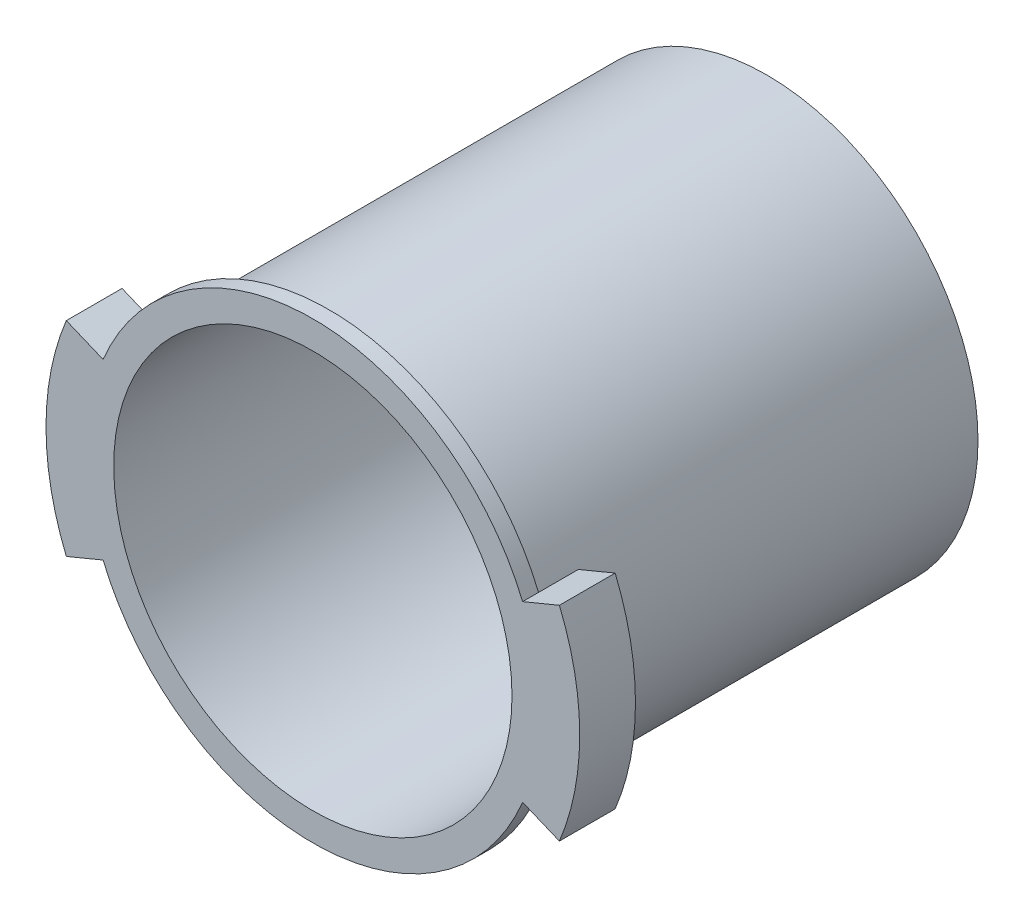
ISO-10303-21;
HEADER;
FILE_DESCRIPTION(('STEP AP214'),'2;1');
FILE_NAME('part.step','',(''),(''),'','','');
FILE_SCHEMA(('AUTOMOTIVE_DESIGN { 1 0 10303 214 1 1 1 1 }'));
ENDSEC;
DATA;
#1=APPLICATION_CONTEXT('core data for automotive mechanical design processes');
#2=APPLICATION_PROTOCOL_DEFINITION('international standard','automotive_design',2000,#1);
#3=PRODUCT_CONTEXT('',#1,'mechanical');
#4=PRODUCT('Part','Part','',(#3));
#5=PRODUCT_RELATED_PRODUCT_CATEGORY('part','',(#4));
#6=PRODUCT_DEFINITION_FORMATION('','',#4);
#7=PRODUCT_DEFINITION_CONTEXT('part definition',#1,'design');
#8=PRODUCT_DEFINITION('design','',#6,#7);
#9=PRODUCT_DEFINITION_SHAPE('','',#8);
#10=(LENGTH_UNIT() NAMED_UNIT(*) SI_UNIT(.MILLI.,.METRE.));
#11=(NAMED_UNIT(*) PLANE_ANGLE_UNIT() SI_UNIT($,.RADIAN.));
#12=(NAMED_UNIT(*) SI_UNIT($,.STERADIAN.) SOLID_ANGLE_UNIT());
#13=UNCERTAINTY_MEASURE_WITH_UNIT(LENGTH_MEASURE(1.E-05),#10,'distance_accuracy_value','');
#14=(GEOMETRIC_REPRESENTATION_CONTEXT(3) GLOBAL_UNCERTAINTY_ASSIGNED_CONTEXT((#13)) GLOBAL_UNIT_ASSIGNED_CONTEXT((#10,
#11,#12)) REPRESENTATION_CONTEXT('',''));
#15=CARTESIAN_POINT('',(0.,0.,0.));
#16=DIRECTION('',(0.,0.,1.));
#17=DIRECTION('',(1.,0.,0.));
#18=AXIS2_PLACEMENT_3D('',#15,#16,#17);
#19=CARTESIAN_POINT('',(0.,0.,55.));
#20=DIRECTION('',(0.,0.,-1.));
#21=DIRECTION('',(-1.,0.,0.));
#22=AXIS2_PLACEMENT_3D('',#19,#20,#21);
#23=CYLINDRICAL_SURFACE('',#22,25.);
#24=CARTESIAN_POINT('',(0.,0.,57.));
#25=DIRECTION('',(0.,0.,1.));
#26=DIRECTION('',(1.,0.,0.));
#27=AXIS2_PLACEMENT_3D('',#24,#25,#26);
#28=CIRCLE('',#27,25.);
#29=CARTESIAN_POINT('',(25.,0.,57.));
#30=VERTEX_POINT('',#29);
#31=EDGE_CURVE('E359',#30,#30,#28,.T.);
#32=ORIENTED_EDGE('',*,*,#31,.T.);
#33=EDGE_LOOP('',(#32));
#34=FACE_BOUND('',#33,.T.);
#35=CARTESIAN_POINT('',(0.,0.,0.));
#36=DIRECTION('',(0.,0.,1.));
#37=DIRECTION('',(1.,0.,0.));
#38=AXIS2_PLACEMENT_3D('',#35,#36,#37);
#39=CIRCLE('',#38,25.);
#40=CARTESIAN_POINT('',(10.,-22.9128784747792,0.));
#41=VERTEX_POINT('',#40);
#42=CARTESIAN_POINT('',(-10.,-22.9128784747792,0.));
#43=VERTEX_POINT('',#42);
#44=EDGE_CURVE('E424',#41,#43,#39,.T.);
#45=ORIENTED_EDGE('',*,*,#44,.F.);
#46=DIRECTION('',(0.,0.,-1.));
#47=VECTOR('',#46,1.);
#48=CARTESIAN_POINT('',(10.,-22.9128784747792,55.));
#49=LINE('',#48,#47);
#50=CARTESIAN_POINT('',(10.,-22.9128784747792,20.));
#51=VERTEX_POINT('',#50);
#52=EDGE_CURVE('E11',#41,#51,#49,.F.);
#53=ORIENTED_EDGE('',*,*,#52,.T.);
#54=CARTESIAN_POINT('',(0.,0.,20.));
#55=DIRECTION('',(0.,0.,1.));
#56=DIRECTION('',(1.,0.,0.));
#57=AXIS2_PLACEMENT_3D('',#54,#55,#56);
#58=CIRCLE('',#57,25.);
#59=CARTESIAN_POINT('',(-10.,-22.9128784747792,20.));
#60=VERTEX_POINT('',#59);
#61=EDGE_CURVE('E433',#60,#51,#58,.T.);
#62=ORIENTED_EDGE('',*,*,#61,.F.);
#63=DIRECTION('',(0.,0.,-1.));
#64=VECTOR('',#63,1.);
#65=CARTESIAN_POINT('',(-10.,-22.9128784747792,55.));
#66=LINE('',#65,#64);
#67=EDGE_CURVE('E56',#60,#43,#66,.T.);
#68=ORIENTED_EDGE('',*,*,#67,.T.);
#69=EDGE_LOOP('',(#45,#53,#62,#68));
#70=FACE_BOUND('',#69,.T.);
#71=DIRECTION('',(0.,0.,-1.));
#72=VECTOR('',#71,1.);
#73=CARTESIAN_POINT('',(24.4948974278318,-5.,17.));
#74=LINE('',#73,#72);
#75=CARTESIAN_POINT('',(24.4948974278318,-5.,17.));
#76=VERTEX_POINT('',#75);
#77=CARTESIAN_POINT('',(24.4948974278318,-5.,15.));
#78=VERTEX_POINT('',#77);
#79=EDGE_CURVE('E271',#76,#78,#74,.T.);
#80=ORIENTED_EDGE('',*,*,#79,.F.);
#81=CARTESIAN_POINT('',(0.,0.,17.));
#82=DIRECTION('',(0.,0.,-1.));
#83=DIRECTION('',(-1.,0.,0.));
#84=AXIS2_PLACEMENT_3D('',#81,#82,#83);
#85=CIRCLE('',#84,25.);
#86=CARTESIAN_POINT('',(21.9317121994613,-12.,17.));
#87=VERTEX_POINT('',#86);
#88=EDGE_CURVE('E243',#87,#76,#85,.F.);
#89=ORIENTED_EDGE('',*,*,#88,.F.);
#90=DIRECTION('',(0.,0.,-1.));
#91=VECTOR('',#90,1.);
#92=CARTESIAN_POINT('',(21.9317121994613,-12.,17.));
#93=LINE('',#92,#91);
#94=CARTESIAN_POINT('',(21.9317121994613,-12.,15.));
#95=VERTEX_POINT('',#94);
#96=EDGE_CURVE('E258',#87,#95,#93,.T.);
#97=ORIENTED_EDGE('',*,*,#96,.T.);
#98=CARTESIAN_POINT('',(0.,0.,15.));
#99=DIRECTION('',(0.,0.,-1.));
#100=DIRECTION('',(-1.,0.,0.));
#101=AXIS2_PLACEMENT_3D('',#98,#99,#100);
#102=CIRCLE('',#101,25.);
#103=EDGE_CURVE('E239',#95,#78,#102,.F.);
#104=ORIENTED_EDGE('',*,*,#103,.T.);
#105=EDGE_LOOP('',(#80,#89,#97,#104));
#106=FACE_BOUND('',#105,.T.);
#107=DIRECTION('',(0.,0.,-1.));
#108=VECTOR('',#107,1.);
#109=CARTESIAN_POINT('',(-21.9317121994613,-12.,17.));
#110=LINE('',#109,#108);
#111=CARTESIAN_POINT('',(-21.9317121994613,-12.,17.));
#112=VERTEX_POINT('',#111);
#113=CARTESIAN_POINT('',(-21.9317121994613,-12.,15.));
#114=VERTEX_POINT('',#113);
#115=EDGE_CURVE('E63',#112,#114,#110,.T.);
#116=ORIENTED_EDGE('',*,*,#115,.F.);
#117=CARTESIAN_POINT('',(0.,0.,17.));
#118=DIRECTION('',(0.,0.,-1.));
#119=DIRECTION('',(-1.,0.,0.));
#120=AXIS2_PLACEMENT_3D('',#117,#118,#119);
#121=CIRCLE('',#120,25.);
#122=CARTESIAN_POINT('',(-24.4948974278318,-5.,17.));
#123=VERTEX_POINT('',#122);
#124=EDGE_CURVE('E68',#112,#123,#121,.T.);
#125=ORIENTED_EDGE('',*,*,#124,.T.);
#126=DIRECTION('',(0.,0.,-1.));
#127=VECTOR('',#126,1.);
#128=CARTESIAN_POINT('',(-24.4948974278318,-5.,17.));
#129=LINE('',#128,#127);
#130=CARTESIAN_POINT('',(-24.4948974278318,-5.,15.));
#131=VERTEX_POINT('',#130);
#132=EDGE_CURVE('E208',#123,#131,#129,.T.);
#133=ORIENTED_EDGE('',*,*,#132,.T.);
#134=CARTESIAN_POINT('',(0.,0.,15.));
#135=DIRECTION('',(0.,0.,-1.));
#136=DIRECTION('',(-1.,0.,0.));
#137=AXIS2_PLACEMENT_3D('',#134,#135,#136);
#138=CIRCLE('',#137,25.);
#139=EDGE_CURVE('E229',#114,#131,#138,.T.);
#140=ORIENTED_EDGE('',*,*,#139,.F.);
#141=EDGE_LOOP('',(#116,#125,#133,#140));
#142=FACE_BOUND('',#141,.T.);
#143=ADVANCED_FACE('F47',(#34,#70,#106,#142),#23,.F.);
#144=CARTESIAN_POINT('',(0.,0.,0.));
#145=DIRECTION('',(0.,0.,1.));
#146=DIRECTION('',(1.,0.,0.));
#147=AXIS2_PLACEMENT_3D('',#144,#145,#146);
#148=PLANE('',#147);
#149=DIRECTION('',(0.,-1.,0.));
#150=VECTOR('',#149,1.);
#151=CARTESIAN_POINT('',(10.,0.,0.));
#152=LINE('',#151,#150);
#153=CARTESIAN_POINT('',(10.,-24.5407823836161,0.));
#154=VERTEX_POINT('',#153);
#155=EDGE_CURVE('E301',#41,#154,#152,.T.);
#156=ORIENTED_EDGE('',*,*,#155,.F.);
#157=ORIENTED_EDGE('',*,*,#44,.T.);
#158=DIRECTION('',(0.,1.,0.));
#159=VECTOR('',#158,1.);
#160=CARTESIAN_POINT('',(-10.,0.,0.));
#161=LINE('',#160,#159);
#162=CARTESIAN_POINT('',(-10.,-24.5407823836161,0.));
#163=VERTEX_POINT('',#162);
#164=EDGE_CURVE('E295',#163,#43,#161,.T.);
#165=ORIENTED_EDGE('',*,*,#164,.F.);
#166=CARTESIAN_POINT('',(0.,0.,0.));
#167=DIRECTION('',(0.,0.,1.));
#168=DIRECTION('',(1.,0.,0.));
#169=AXIS2_PLACEMENT_3D('',#166,#167,#168);
#170=CIRCLE('',#169,26.5);
#171=EDGE_CURVE('E428',#154,#163,#170,.T.);
#172=ORIENTED_EDGE('',*,*,#171,.F.);
#173=EDGE_LOOP('',(#156,#157,#165,#172));
#174=FACE_BOUND('',#173,.T.);
#175=ADVANCED_FACE('F450',(#174),#148,.F.);
#176=CARTESIAN_POINT('',(0.,0.,55.));
#177=DIRECTION('',(0.,0.,-1.));
#178=DIRECTION('',(-1.,0.,0.));
#179=AXIS2_PLACEMENT_3D('',#176,#177,#178);
#180=CYLINDRICAL_SURFACE('',#179,26.5);
#181=CARTESIAN_POINT('',(0.,0.,55.));
#182=DIRECTION('',(0.,0.,1.));
#183=DIRECTION('',(1.,0.,0.));
#184=AXIS2_PLACEMENT_3D('',#181,#182,#183);
#185=CIRCLE('',#184,26.5);
#186=CARTESIAN_POINT('',(26.5,0.,55.));
#187=VERTEX_POINT('',#186);
#188=EDGE_CURVE('E429',#187,#187,#185,.T.);
#189=ORIENTED_EDGE('',*,*,#188,.F.);
#190=EDGE_LOOP('',(#189));
#191=FACE_BOUND('',#190,.T.);
#192=DIRECTION('',(0.,0.,-1.));
#193=VECTOR('',#192,1.);
#194=CARTESIAN_POINT('',(10.,-24.5407823836161,55.));
#195=LINE('',#194,#193);
#196=CARTESIAN_POINT('',(10.,-24.5407823836161,20.));
#197=VERTEX_POINT('',#196);
#198=EDGE_CURVE('E304',#154,#197,#195,.F.);
#199=ORIENTED_EDGE('',*,*,#198,.F.);
#200=ORIENTED_EDGE('',*,*,#171,.T.);
#201=DIRECTION('',(0.,0.,-1.));
#202=VECTOR('',#201,1.);
#203=CARTESIAN_POINT('',(-10.,-24.5407823836161,55.));
#204=LINE('',#203,#202);
#205=CARTESIAN_POINT('',(-10.,-24.5407823836161,20.));
#206=VERTEX_POINT('',#205);
#207=EDGE_CURVE('E298',#206,#163,#204,.T.);
#208=ORIENTED_EDGE('',*,*,#207,.F.);
#209=CARTESIAN_POINT('',(0.,0.,20.));
#210=DIRECTION('',(0.,0.,1.));
#211=DIRECTION('',(1.,0.,0.));
#212=AXIS2_PLACEMENT_3D('',#209,#210,#211);
#213=CIRCLE('',#212,26.5);
#214=EDGE_CURVE('E291',#206,#197,#213,.T.);
#215=ORIENTED_EDGE('',*,*,#214,.T.);
#216=EDGE_LOOP('',(#199,#200,#208,#215));
#217=FACE_BOUND('',#216,.T.);
#218=ADVANCED_FACE('F49',(#191,#217),#180,.T.);
#219=CARTESIAN_POINT('',(0.,0.,57.));
#220=DIRECTION('',(0.,0.,1.));
#221=DIRECTION('',(1.,0.,0.));
#222=AXIS2_PLACEMENT_3D('',#219,#220,#221);
#223=PLANE('',#222);
#224=CARTESIAN_POINT('',(0.,0.,57.));
#225=DIRECTION('',(0.,0.,1.));
#226=DIRECTION('',(1.,0.,0.));
#227=AXIS2_PLACEMENT_3D('',#224,#225,#226);
#228=CIRCLE('',#227,28.5);
#229=CARTESIAN_POINT('',(26.3305666765717,10.9064778224051,57.));
#230=VERTEX_POINT('',#229);
#231=CARTESIAN_POINT('',(-26.3305666765717,10.9064778224051,57.));
#232=VERTEX_POINT('',#231);
#233=EDGE_CURVE('E364',#230,#232,#228,.T.);
#234=ORIENTED_EDGE('',*,*,#233,.T.);
#235=DIRECTION('',(-0.923879532511286,0.382683432365092,0.));
#236=VECTOR('',#235,1.);
#237=CARTESIAN_POINT('',(-26.3305666765717,10.9064778224051,57.));
#238=LINE('',#237,#236);
#239=CARTESIAN_POINT('',(-30.9499643391281,12.8198949842305,57.));
#240=VERTEX_POINT('',#239);
#241=EDGE_CURVE('E368',#232,#240,#238,.T.);
#242=ORIENTED_EDGE('',*,*,#241,.T.);
#243=CARTESIAN_POINT('',(0.,0.,57.));
#244=DIRECTION('',(0.,0.,1.));
#245=DIRECTION('',(1.,0.,0.));
#246=AXIS2_PLACEMENT_3D('',#243,#244,#245);
#247=CIRCLE('',#246,33.5);
#248=CARTESIAN_POINT('',(-30.9499643391281,-12.8198949842305,57.));
#249=VERTEX_POINT('',#248);
#250=EDGE_CURVE('E372',#240,#249,#247,.T.);
#251=ORIENTED_EDGE('',*,*,#250,.T.);
#252=DIRECTION('',(0.923879532511287,0.38268343236509,0.));
#253=VECTOR('',#252,1.);
#254=CARTESIAN_POINT('',(-26.3305666765717,-10.9064778224051,57.));
#255=LINE('',#254,#253);
#256=CARTESIAN_POINT('',(-26.3305666765717,-10.9064778224051,57.));
#257=VERTEX_POINT('',#256);
#258=EDGE_CURVE('E375',#249,#257,#255,.T.);
#259=ORIENTED_EDGE('',*,*,#258,.T.);
#260=CARTESIAN_POINT('',(0.,0.,57.));
#261=DIRECTION('',(0.,0.,1.));
#262=DIRECTION('',(1.,0.,0.));
#263=AXIS2_PLACEMENT_3D('',#260,#261,#262);
#264=CIRCLE('',#263,28.5);
#265=CARTESIAN_POINT('',(26.3305666765717,-10.9064778224051,57.));
#266=VERTEX_POINT('',#265);
#267=EDGE_CURVE('E378',#257,#266,#264,.T.);
#268=ORIENTED_EDGE('',*,*,#267,.T.);
#269=DIRECTION('',(0.923879532511287,-0.38268343236509,0.));
#270=VECTOR('',#269,1.);
#271=CARTESIAN_POINT('',(26.3305666765717,-10.9064778224051,57.));
#272=LINE('',#271,#270);
#273=CARTESIAN_POINT('',(30.9499643391281,-12.8198949842305,57.));
#274=VERTEX_POINT('',#273);
#275=EDGE_CURVE('E381',#266,#274,#272,.T.);
#276=ORIENTED_EDGE('',*,*,#275,.T.);
#277=CARTESIAN_POINT('',(0.,0.,57.));
#278=DIRECTION('',(0.,0.,1.));
#279=DIRECTION('',(1.,0.,0.));
#280=AXIS2_PLACEMENT_3D('',#277,#278,#279);
#281=CIRCLE('',#280,33.5);
#282=CARTESIAN_POINT('',(30.9499643391281,12.8198949842305,57.));
#283=VERTEX_POINT('',#282);
#284=EDGE_CURVE('E384',#274,#283,#281,.T.);
#285=ORIENTED_EDGE('',*,*,#284,.T.);
#286=DIRECTION('',(-0.923879532511287,-0.38268343236509,0.));
#287=VECTOR('',#286,1.);
#288=CARTESIAN_POINT('',(26.3305666765717,10.9064778224051,57.));
#289=LINE('',#288,#287);
#290=EDGE_CURVE('E387',#283,#230,#289,.T.);
#291=ORIENTED_EDGE('',*,*,#290,.T.);
#292=EDGE_LOOP('',(#234,#242,#251,#259,#268,#276,#285,#291));
#293=FACE_BOUND('',#292,.T.);
#294=ORIENTED_EDGE('',*,*,#31,.F.);
#295=EDGE_LOOP('',(#294));
#296=FACE_BOUND('',#295,.T.);
#297=ADVANCED_FACE('F516',(#293,#296),#223,.T.);
#298=CARTESIAN_POINT('',(0.,0.,55.));
#299=DIRECTION('',(0.,0.,1.));
#300=DIRECTION('',(1.,0.,0.));
#301=AXIS2_PLACEMENT_3D('',#298,#299,#300);
#302=PLANE('',#301);
#303=ORIENTED_EDGE('',*,*,#188,.T.);
#304=EDGE_LOOP('',(#303));
#305=FACE_BOUND('',#304,.T.);
#306=CARTESIAN_POINT('',(0.,0.,55.));
#307=DIRECTION('',(0.,0.,1.));
#308=DIRECTION('',(1.,0.,0.));
#309=AXIS2_PLACEMENT_3D('',#306,#307,#308);
#310=CIRCLE('',#309,28.5);
#311=CARTESIAN_POINT('',(-26.3305666765717,-10.9064778224051,55.));
#312=VERTEX_POINT('',#311);
#313=CARTESIAN_POINT('',(26.3305666765717,-10.9064778224051,55.));
#314=VERTEX_POINT('',#313);
#315=EDGE_CURVE('E369',#312,#314,#310,.T.);
#316=ORIENTED_EDGE('',*,*,#315,.F.);
#317=CARTESIAN_POINT('',(0.,0.,55.));
#318=DIRECTION('',(0.,0.,-1.));
#319=DIRECTION('',(-1.,0.,0.));
#320=AXIS2_PLACEMENT_3D('',#317,#318,#319);
#321=CIRCLE('',#320,28.5);
#322=CARTESIAN_POINT('',(-26.3305666765717,10.9064778224051,55.));
#323=VERTEX_POINT('',#322);
#324=EDGE_CURVE('E307',#312,#323,#321,.T.);
#325=ORIENTED_EDGE('',*,*,#324,.T.);
#326=CARTESIAN_POINT('',(0.,0.,55.));
#327=DIRECTION('',(0.,0.,1.));
#328=DIRECTION('',(1.,0.,0.));
#329=AXIS2_PLACEMENT_3D('',#326,#327,#328);
#330=CIRCLE('',#329,28.5);
#331=CARTESIAN_POINT('',(26.3305666765717,10.9064778224051,55.));
#332=VERTEX_POINT('',#331);
#333=EDGE_CURVE('E363',#332,#323,#330,.T.);
#334=ORIENTED_EDGE('',*,*,#333,.F.);
#335=CARTESIAN_POINT('',(0.,0.,55.));
#336=DIRECTION('',(0.,0.,-1.));
#337=DIRECTION('',(-1.,0.,0.));
#338=AXIS2_PLACEMENT_3D('',#335,#336,#337);
#339=CIRCLE('',#338,28.5);
#340=EDGE_CURVE('E333',#332,#314,#339,.T.);
#341=ORIENTED_EDGE('',*,*,#340,.T.);
#342=EDGE_LOOP('',(#316,#325,#334,#341));
#343=FACE_BOUND('',#342,.T.);
#344=ADVANCED_FACE('F484',(#305,#343),#302,.F.);
#345=CARTESIAN_POINT('',(0.,0.,57.));
#346=DIRECTION('',(0.,0.,-1.));
#347=DIRECTION('',(-1.,0.,0.));
#348=AXIS2_PLACEMENT_3D('',#345,#346,#347);
#349=CYLINDRICAL_SURFACE('',#348,28.5);
#350=ORIENTED_EDGE('',*,*,#333,.T.);
#351=DIRECTION('',(0.,0.,-1.));
#352=VECTOR('',#351,1.);
#353=CARTESIAN_POINT('',(-26.3305666765717,10.9064778224051,57.));
#354=LINE('',#353,#352);
#355=EDGE_CURVE('E420',#232,#323,#354,.T.);
#356=ORIENTED_EDGE('',*,*,#355,.F.);
#357=ORIENTED_EDGE('',*,*,#233,.F.);
#358=DIRECTION('',(0.,0.,-1.));
#359=VECTOR('',#358,1.);
#360=CARTESIAN_POINT('',(26.3305666765717,10.9064778224051,57.));
#361=LINE('',#360,#359);
#362=EDGE_CURVE('E390',#230,#332,#361,.T.);
#363=ORIENTED_EDGE('',*,*,#362,.T.);
#364=EDGE_LOOP('',(#350,#356,#357,#363));
#365=FACE_BOUND('',#364,.T.);
#366=ADVANCED_FACE('F480',(#365),#349,.T.);
#367=CARTESIAN_POINT('',(-26.3305666765717,10.9064778224051,57.));
#368=DIRECTION('',(-0.382683432365092,-0.923879532511286,0.));
#369=DIRECTION('',(0.923879532511286,-0.382683432365092,0.));
#370=AXIS2_PLACEMENT_3D('',#367,#368,#369);
#371=PLANE('',#370);
#372=ORIENTED_EDGE('',*,*,#355,.T.);
#373=DIRECTION('',(0.,0.,1.));
#374=VECTOR('',#373,1.);
#375=CARTESIAN_POINT('',(-26.3305666765717,10.9064778224051,50.));
#376=LINE('',#375,#374);
#377=CARTESIAN_POINT('',(-26.3305666765717,10.9064778224051,50.));
#378=VERTEX_POINT('',#377);
#379=EDGE_CURVE('E323',#378,#323,#376,.T.);
#380=ORIENTED_EDGE('',*,*,#379,.F.);
#381=DIRECTION('',(0.923879532511286,-0.382683432365092,0.));
#382=VECTOR('',#381,1.);
#383=CARTESIAN_POINT('',(0.,0.,50.));
#384=LINE('',#383,#382);
#385=CARTESIAN_POINT('',(-30.9499643391281,12.8198949842305,50.));
#386=VERTEX_POINT('',#385);
#387=EDGE_CURVE('E320',#386,#378,#384,.T.);
#388=ORIENTED_EDGE('',*,*,#387,.F.);
#389=DIRECTION('',(0.,0.,-1.));
#390=VECTOR('',#389,1.);
#391=CARTESIAN_POINT('',(-30.9499643391281,12.8198949842305,57.));
#392=LINE('',#391,#390);
#393=EDGE_CURVE('E417',#240,#386,#392,.T.);
#394=ORIENTED_EDGE('',*,*,#393,.F.);
#395=ORIENTED_EDGE('',*,*,#241,.F.);
#396=EDGE_LOOP('',(#372,#380,#388,#394,#395));
#397=FACE_BOUND('',#396,.T.);
#398=ADVANCED_FACE('F483',(#397),#371,.F.);
#399=CARTESIAN_POINT('',(0.,0.,57.));
#400=DIRECTION('',(0.,0.,-1.));
#401=DIRECTION('',(-1.,0.,0.));
#402=AXIS2_PLACEMENT_3D('',#399,#400,#401);
#403=CYLINDRICAL_SURFACE('',#402,33.5);
#404=ORIENTED_EDGE('',*,*,#393,.T.);
#405=CARTESIAN_POINT('',(0.,0.,50.));
#406=DIRECTION('',(0.,0.,-1.));
#407=DIRECTION('',(-1.,0.,0.));
#408=AXIS2_PLACEMENT_3D('',#405,#406,#407);
#409=CIRCLE('',#408,33.5);
#410=CARTESIAN_POINT('',(-30.9499643391281,-12.8198949842305,50.));
#411=VERTEX_POINT('',#410);
#412=EDGE_CURVE('E316',#411,#386,#409,.T.);
#413=ORIENTED_EDGE('',*,*,#412,.F.);
#414=DIRECTION('',(0.,0.,-1.));
#415=VECTOR('',#414,1.);
#416=CARTESIAN_POINT('',(-30.9499643391281,-12.8198949842305,57.));
#417=LINE('',#416,#415);
#418=EDGE_CURVE('E414',#249,#411,#417,.T.);
#419=ORIENTED_EDGE('',*,*,#418,.F.);
#420=ORIENTED_EDGE('',*,*,#250,.F.);
#421=EDGE_LOOP('',(#404,#413,#419,#420));
#422=FACE_BOUND('',#421,.T.);
#423=ADVANCED_FACE('F488',(#422),#403,.T.);
#424=CARTESIAN_POINT('',(-26.3305666765717,-10.9064778224051,57.));
#425=DIRECTION('',(-0.38268343236509,0.923879532511287,0.));
#426=DIRECTION('',(-0.923879532511287,-0.38268343236509,0.));
#427=AXIS2_PLACEMENT_3D('',#424,#425,#426);
#428=PLANE('',#427);
#429=ORIENTED_EDGE('',*,*,#418,.T.);
#430=DIRECTION('',(-0.923879532511287,-0.38268343236509,0.));
#431=VECTOR('',#430,1.);
#432=CARTESIAN_POINT('',(0.,0.,50.));
#433=LINE('',#432,#431);
#434=CARTESIAN_POINT('',(-26.3305666765717,-10.9064778224051,50.));
#435=VERTEX_POINT('',#434);
#436=EDGE_CURVE('E312',#435,#411,#433,.T.);
#437=ORIENTED_EDGE('',*,*,#436,.F.);
#438=DIRECTION('',(0.,0.,1.));
#439=VECTOR('',#438,1.);
#440=CARTESIAN_POINT('',(-26.3305666765717,-10.9064778224051,50.));
#441=LINE('',#440,#439);
#442=EDGE_CURVE('E329',#435,#312,#441,.T.);
#443=ORIENTED_EDGE('',*,*,#442,.T.);
#444=DIRECTION('',(0.,0.,-1.));
#445=VECTOR('',#444,1.);
#446=CARTESIAN_POINT('',(-26.3305666765717,-10.9064778224051,57.));
#447=LINE('',#446,#445);
#448=EDGE_CURVE('E410',#257,#312,#447,.T.);
#449=ORIENTED_EDGE('',*,*,#448,.F.);
#450=ORIENTED_EDGE('',*,*,#258,.F.);
#451=EDGE_LOOP('',(#429,#437,#443,#449,#450));
#452=FACE_BOUND('',#451,.T.);
#453=ADVANCED_FACE('F492',(#452),#428,.F.);
#454=CARTESIAN_POINT('',(0.,0.,57.));
#455=DIRECTION('',(0.,0.,-1.));
#456=DIRECTION('',(-1.,0.,0.));
#457=AXIS2_PLACEMENT_3D('',#454,#455,#456);
#458=CYLINDRICAL_SURFACE('',#457,28.5);
#459=ORIENTED_EDGE('',*,*,#315,.T.);
#460=DIRECTION('',(0.,0.,-1.));
#461=VECTOR('',#460,1.);
#462=CARTESIAN_POINT('',(26.3305666765717,-10.9064778224051,57.));
#463=LINE('',#462,#461);
#464=EDGE_CURVE('E406',#266,#314,#463,.T.);
#465=ORIENTED_EDGE('',*,*,#464,.F.);
#466=ORIENTED_EDGE('',*,*,#267,.F.);
#467=ORIENTED_EDGE('',*,*,#448,.T.);
#468=EDGE_LOOP('',(#459,#465,#466,#467));
#469=FACE_BOUND('',#468,.T.);
#470=ADVANCED_FACE('F496',(#469),#458,.T.);
#471=CARTESIAN_POINT('',(26.3305666765717,-10.9064778224051,57.));
#472=DIRECTION('',(0.38268343236509,0.923879532511287,0.));
#473=DIRECTION('',(-0.923879532511287,0.38268343236509,0.));
#474=AXIS2_PLACEMENT_3D('',#471,#472,#473);
#475=PLANE('',#474);
#476=ORIENTED_EDGE('',*,*,#464,.T.);
#477=DIRECTION('',(0.,0.,1.));
#478=VECTOR('',#477,1.);
#479=CARTESIAN_POINT('',(26.3305666765717,-10.9064778224051,50.));
#480=LINE('',#479,#478);
#481=CARTESIAN_POINT('',(26.3305666765717,-10.9064778224051,50.));
#482=VERTEX_POINT('',#481);
#483=EDGE_CURVE('E349',#482,#314,#480,.T.);
#484=ORIENTED_EDGE('',*,*,#483,.F.);
#485=DIRECTION('',(-0.923879532511287,0.38268343236509,0.));
#486=VECTOR('',#485,1.);
#487=CARTESIAN_POINT('',(0.,0.,50.));
#488=LINE('',#487,#486);
#489=CARTESIAN_POINT('',(30.9499643391281,-12.8198949842305,50.));
#490=VERTEX_POINT('',#489);
#491=EDGE_CURVE('E346',#490,#482,#488,.T.);
#492=ORIENTED_EDGE('',*,*,#491,.F.);
#493=DIRECTION('',(0.,0.,-1.));
#494=VECTOR('',#493,1.);
#495=CARTESIAN_POINT('',(30.9499643391281,-12.8198949842305,57.));
#496=LINE('',#495,#494);
#497=EDGE_CURVE('E403',#274,#490,#496,.T.);
#498=ORIENTED_EDGE('',*,*,#497,.F.);
#499=ORIENTED_EDGE('',*,*,#275,.F.);
#500=EDGE_LOOP('',(#476,#484,#492,#498,#499));
#501=FACE_BOUND('',#500,.T.);
#502=ADVANCED_FACE('F500',(#501),#475,.F.);
#503=CARTESIAN_POINT('',(0.,0.,57.));
#504=DIRECTION('',(0.,0.,-1.));
#505=DIRECTION('',(-1.,0.,0.));
#506=AXIS2_PLACEMENT_3D('',#503,#504,#505);
#507=CYLINDRICAL_SURFACE('',#506,33.5);
#508=ORIENTED_EDGE('',*,*,#497,.T.);
#509=CARTESIAN_POINT('',(0.,0.,50.));
#510=DIRECTION('',(0.,0.,-1.));
#511=DIRECTION('',(-1.,0.,0.));
#512=AXIS2_PLACEMENT_3D('',#509,#510,#511);
#513=CIRCLE('',#512,33.5);
#514=CARTESIAN_POINT('',(30.9499643391281,12.8198949842305,50.));
#515=VERTEX_POINT('',#514);
#516=EDGE_CURVE('E342',#515,#490,#513,.T.);
#517=ORIENTED_EDGE('',*,*,#516,.F.);
#518=DIRECTION('',(0.,0.,-1.));
#519=VECTOR('',#518,1.);
#520=CARTESIAN_POINT('',(30.9499643391281,12.8198949842305,57.));
#521=LINE('',#520,#519);
#522=EDGE_CURVE('E400',#283,#515,#521,.T.);
#523=ORIENTED_EDGE('',*,*,#522,.F.);
#524=ORIENTED_EDGE('',*,*,#284,.F.);
#525=EDGE_LOOP('',(#508,#517,#523,#524));
#526=FACE_BOUND('',#525,.T.);
#527=ADVANCED_FACE('F504',(#526),#507,.T.);
#528=CARTESIAN_POINT('',(26.3305666765717,10.9064778224051,57.));
#529=DIRECTION('',(0.38268343236509,-0.923879532511287,0.));
#530=DIRECTION('',(0.923879532511287,0.38268343236509,0.));
#531=AXIS2_PLACEMENT_3D('',#528,#529,#530);
#532=PLANE('',#531);
#533=ORIENTED_EDGE('',*,*,#522,.T.);
#534=DIRECTION('',(0.923879532511287,0.38268343236509,0.));
#535=VECTOR('',#534,1.);
#536=CARTESIAN_POINT('',(0.,0.,50.));
#537=LINE('',#536,#535);
#538=CARTESIAN_POINT('',(26.3305666765717,10.9064778224051,50.));
#539=VERTEX_POINT('',#538);
#540=EDGE_CURVE('E338',#539,#515,#537,.T.);
#541=ORIENTED_EDGE('',*,*,#540,.F.);
#542=DIRECTION('',(0.,0.,1.));
#543=VECTOR('',#542,1.);
#544=CARTESIAN_POINT('',(26.3305666765717,10.9064778224051,50.));
#545=LINE('',#544,#543);
#546=EDGE_CURVE('E355',#539,#332,#545,.T.);
#547=ORIENTED_EDGE('',*,*,#546,.T.);
#548=ORIENTED_EDGE('',*,*,#362,.F.);
#549=ORIENTED_EDGE('',*,*,#290,.F.);
#550=EDGE_LOOP('',(#533,#541,#547,#548,#549));
#551=FACE_BOUND('',#550,.T.);
#552=ADVANCED_FACE('F508',(#551),#532,.F.);
#553=CARTESIAN_POINT('',(0.,0.,50.));
#554=DIRECTION('',(0.,0.,1.));
#555=DIRECTION('',(1.,0.,0.));
#556=AXIS2_PLACEMENT_3D('',#553,#554,#555);
#557=CYLINDRICAL_SURFACE('',#556,28.5);
#558=ORIENTED_EDGE('',*,*,#340,.F.);
#559=ORIENTED_EDGE('',*,*,#546,.F.);
#560=CARTESIAN_POINT('',(0.,0.,50.));
#561=DIRECTION('',(0.,0.,-1.));
#562=DIRECTION('',(-1.,0.,0.));
#563=AXIS2_PLACEMENT_3D('',#560,#561,#562);
#564=CIRCLE('',#563,28.5);
#565=EDGE_CURVE('E334',#539,#482,#564,.T.);
#566=ORIENTED_EDGE('',*,*,#565,.T.);
#567=ORIENTED_EDGE('',*,*,#483,.T.);
#568=EDGE_LOOP('',(#558,#559,#566,#567));
#569=FACE_BOUND('',#568,.T.);
#570=ADVANCED_FACE('F512',(#569),#557,.F.);
#571=CARTESIAN_POINT('',(0.,0.,50.));
#572=DIRECTION('',(0.,0.,-1.));
#573=DIRECTION('',(-1.,0.,0.));
#574=AXIS2_PLACEMENT_3D('',#571,#572,#573);
#575=PLANE('',#574);
#576=ORIENTED_EDGE('',*,*,#565,.F.);
#577=ORIENTED_EDGE('',*,*,#540,.T.);
#578=ORIENTED_EDGE('',*,*,#516,.T.);
#579=ORIENTED_EDGE('',*,*,#491,.T.);
#580=EDGE_LOOP('',(#576,#577,#578,#579));
#581=FACE_BOUND('',#580,.T.);
#582=ADVANCED_FACE('F523',(#581),#575,.T.);
#583=CARTESIAN_POINT('',(0.,0.,50.));
#584=DIRECTION('',(0.,0.,1.));
#585=DIRECTION('',(1.,0.,0.));
#586=AXIS2_PLACEMENT_3D('',#583,#584,#585);
#587=CYLINDRICAL_SURFACE('',#586,28.5);
#588=ORIENTED_EDGE('',*,*,#324,.F.);
#589=ORIENTED_EDGE('',*,*,#442,.F.);
#590=CARTESIAN_POINT('',(0.,0.,50.));
#591=DIRECTION('',(0.,0.,-1.));
#592=DIRECTION('',(-1.,0.,0.));
#593=AXIS2_PLACEMENT_3D('',#590,#591,#592);
#594=CIRCLE('',#593,28.5);
#595=EDGE_CURVE('E308',#435,#378,#594,.T.);
#596=ORIENTED_EDGE('',*,*,#595,.T.);
#597=ORIENTED_EDGE('',*,*,#379,.T.);
#598=EDGE_LOOP('',(#588,#589,#596,#597));
#599=FACE_BOUND('',#598,.T.);
#600=ADVANCED_FACE('F527',(#599),#587,.F.);
#601=CARTESIAN_POINT('',(0.,0.,50.));
#602=DIRECTION('',(0.,0.,-1.));
#603=DIRECTION('',(-1.,0.,0.));
#604=AXIS2_PLACEMENT_3D('',#601,#602,#603);
#605=PLANE('',#604);
#606=ORIENTED_EDGE('',*,*,#595,.F.);
#607=ORIENTED_EDGE('',*,*,#436,.T.);
#608=ORIENTED_EDGE('',*,*,#412,.T.);
#609=ORIENTED_EDGE('',*,*,#387,.T.);
#610=EDGE_LOOP('',(#606,#607,#608,#609));
#611=FACE_BOUND('',#610,.T.);
#612=ADVANCED_FACE('F469',(#611),#605,.T.);
#613=CARTESIAN_POINT('',(10.,-30.,-48.));
#614=DIRECTION('',(-1.,0.,0.));
#615=DIRECTION('',(0.,0.,1.));
#616=AXIS2_PLACEMENT_3D('',#613,#614,#615);
#617=PLANE('',#616);
#618=ORIENTED_EDGE('',*,*,#198,.T.);
#619=DIRECTION('',(0.,-1.,0.));
#620=VECTOR('',#619,1.);
#621=CARTESIAN_POINT('',(10.,-30.,20.));
#622=LINE('',#621,#620);
#623=EDGE_CURVE('E275',#51,#197,#622,.T.);
#624=ORIENTED_EDGE('',*,*,#623,.F.);
#625=ORIENTED_EDGE('',*,*,#52,.F.);
#626=ORIENTED_EDGE('',*,*,#155,.T.);
#627=EDGE_LOOP('',(#618,#624,#625,#626));
#628=FACE_BOUND('',#627,.T.);
#629=ADVANCED_FACE('F454',(#628),#617,.T.);
#630=CARTESIAN_POINT('',(-10.,-30.,-48.));
#631=DIRECTION('',(1.,0.,0.));
#632=DIRECTION('',(0.,0.,-1.));
#633=AXIS2_PLACEMENT_3D('',#630,#631,#632);
#634=PLANE('',#633);
#635=ORIENTED_EDGE('',*,*,#207,.T.);
#636=ORIENTED_EDGE('',*,*,#164,.T.);
#637=ORIENTED_EDGE('',*,*,#67,.F.);
#638=DIRECTION('',(0.,1.,0.));
#639=VECTOR('',#638,1.);
#640=CARTESIAN_POINT('',(-10.,-30.,20.));
#641=LINE('',#640,#639);
#642=EDGE_CURVE('E288',#206,#60,#641,.T.);
#643=ORIENTED_EDGE('',*,*,#642,.F.);
#644=EDGE_LOOP('',(#635,#636,#637,#643));
#645=FACE_BOUND('',#644,.T.);
#646=ADVANCED_FACE('F460',(#645),#634,.T.);
#647=CARTESIAN_POINT('',(0.,0.,20.));
#648=DIRECTION('',(0.,0.,1.));
#649=DIRECTION('',(1.,0.,0.));
#650=AXIS2_PLACEMENT_3D('',#647,#648,#649);
#651=PLANE('',#650);
#652=ORIENTED_EDGE('',*,*,#642,.T.);
#653=ORIENTED_EDGE('',*,*,#61,.T.);
#654=ORIENTED_EDGE('',*,*,#623,.T.);
#655=ORIENTED_EDGE('',*,*,#214,.F.);
#656=EDGE_LOOP('',(#652,#653,#654,#655));
#657=FACE_BOUND('',#656,.T.);
#658=ADVANCED_FACE('F459',(#657),#651,.F.);
#659=CARTESIAN_POINT('',(0.,-5.,17.));
#660=DIRECTION('',(0.,-1.,0.));
#661=DIRECTION('',(1.,0.,0.));
#662=AXIS2_PLACEMENT_3D('',#659,#660,#661);
#663=PLANE('',#662);
#664=DIRECTION('',(-1.,0.,0.));
#665=VECTOR('',#664,1.);
#666=CARTESIAN_POINT('',(0.,-5.,15.));
#667=LINE('',#666,#665);
#668=CARTESIAN_POINT('',(17.5,-5.,15.));
#669=VERTEX_POINT('',#668);
#670=EDGE_CURVE('E248',#78,#669,#667,.T.);
#671=ORIENTED_EDGE('',*,*,#670,.T.);
#672=DIRECTION('',(0.,0.,-1.));
#673=VECTOR('',#672,1.);
#674=CARTESIAN_POINT('',(17.5,-5.,17.));
#675=LINE('',#674,#673);
#676=CARTESIAN_POINT('',(17.5,-5.,17.));
#677=VERTEX_POINT('',#676);
#678=EDGE_CURVE('E276',#677,#669,#675,.T.);
#679=ORIENTED_EDGE('',*,*,#678,.F.);
#680=DIRECTION('',(-1.,0.,0.));
#681=VECTOR('',#680,1.);
#682=CARTESIAN_POINT('',(0.,-5.,17.));
#683=LINE('',#682,#681);
#684=EDGE_CURVE('E255',#76,#677,#683,.T.);
#685=ORIENTED_EDGE('',*,*,#684,.F.);
#686=ORIENTED_EDGE('',*,*,#79,.T.);
#687=EDGE_LOOP('',(#671,#679,#685,#686));
#688=FACE_BOUND('',#687,.T.);
#689=ADVANCED_FACE('F467',(#688),#663,.F.);
#690=CARTESIAN_POINT('',(17.5,-8.5,17.));
#691=DIRECTION('',(0.,0.,-1.));
#692=DIRECTION('',(-1.,0.,0.));
#693=AXIS2_PLACEMENT_3D('',#690,#691,#692);
#694=CYLINDRICAL_SURFACE('',#693,3.5);
#695=CARTESIAN_POINT('',(17.5,-8.5,15.));
#696=DIRECTION('',(0.,0.,-1.));
#697=DIRECTION('',(-1.,0.,0.));
#698=AXIS2_PLACEMENT_3D('',#695,#696,#697);
#699=CIRCLE('',#698,3.5);
#700=CARTESIAN_POINT('',(17.5,-12.,15.));
#701=VERTEX_POINT('',#700);
#702=EDGE_CURVE('E265',#669,#701,#699,.F.);
#703=ORIENTED_EDGE('',*,*,#702,.T.);
#704=DIRECTION('',(0.,0.,-1.));
#705=VECTOR('',#704,1.);
#706=CARTESIAN_POINT('',(17.5,-12.,17.));
#707=LINE('',#706,#705);
#708=CARTESIAN_POINT('',(17.5,-12.,17.));
#709=VERTEX_POINT('',#708);
#710=EDGE_CURVE('E280',#709,#701,#707,.T.);
#711=ORIENTED_EDGE('',*,*,#710,.F.);
#712=CARTESIAN_POINT('',(17.5,-8.5,17.));
#713=DIRECTION('',(0.,0.,-1.));
#714=DIRECTION('',(-1.,0.,0.));
#715=AXIS2_PLACEMENT_3D('',#712,#713,#714);
#716=CIRCLE('',#715,3.5);
#717=EDGE_CURVE('E252',#677,#709,#716,.F.);
#718=ORIENTED_EDGE('',*,*,#717,.F.);
#719=ORIENTED_EDGE('',*,*,#678,.T.);
#720=EDGE_LOOP('',(#703,#711,#718,#719));
#721=FACE_BOUND('',#720,.T.);
#722=ADVANCED_FACE('F598',(#721),#694,.T.);
#723=CARTESIAN_POINT('',(0.,-12.,17.));
#724=DIRECTION('',(0.,-1.,0.));
#725=DIRECTION('',(1.,0.,0.));
#726=AXIS2_PLACEMENT_3D('',#723,#724,#725);
#727=PLANE('',#726);
#728=DIRECTION('',(-1.,0.,0.));
#729=VECTOR('',#728,1.);
#730=CARTESIAN_POINT('',(0.,-12.,15.));
#731=LINE('',#730,#729);
#732=EDGE_CURVE('E261',#95,#701,#731,.T.);
#733=ORIENTED_EDGE('',*,*,#732,.F.);
#734=ORIENTED_EDGE('',*,*,#96,.F.);
#735=DIRECTION('',(-1.,0.,0.));
#736=VECTOR('',#735,1.);
#737=CARTESIAN_POINT('',(0.,-12.,17.));
#738=LINE('',#737,#736);
#739=EDGE_CURVE('E247',#87,#709,#738,.T.);
#740=ORIENTED_EDGE('',*,*,#739,.T.);
#741=ORIENTED_EDGE('',*,*,#710,.T.);
#742=EDGE_LOOP('',(#733,#734,#740,#741));
#743=FACE_BOUND('',#742,.T.);
#744=ADVANCED_FACE('F608',(#743),#727,.T.);
#745=CARTESIAN_POINT('',(0.,0.,17.));
#746=DIRECTION('',(0.,0.,-1.));
#747=DIRECTION('',(-1.,0.,0.));
#748=AXIS2_PLACEMENT_3D('',#745,#746,#747);
#749=PLANE('',#748);
#750=ORIENTED_EDGE('',*,*,#88,.T.);
#751=ORIENTED_EDGE('',*,*,#684,.T.);
#752=ORIENTED_EDGE('',*,*,#717,.T.);
#753=ORIENTED_EDGE('',*,*,#739,.F.);
#754=EDGE_LOOP('',(#750,#751,#752,#753));
#755=FACE_BOUND('',#754,.T.);
#756=ADVANCED_FACE('F618',(#755),#749,.F.);
#757=CARTESIAN_POINT('',(0.,0.,15.));
#758=DIRECTION('',(0.,0.,-1.));
#759=DIRECTION('',(-1.,0.,0.));
#760=AXIS2_PLACEMENT_3D('',#757,#758,#759);
#761=PLANE('',#760);
#762=ORIENTED_EDGE('',*,*,#103,.F.);
#763=ORIENTED_EDGE('',*,*,#732,.T.);
#764=ORIENTED_EDGE('',*,*,#702,.F.);
#765=ORIENTED_EDGE('',*,*,#670,.F.);
#766=EDGE_LOOP('',(#762,#763,#764,#765));
#767=FACE_BOUND('',#766,.T.);
#768=ADVANCED_FACE('F628',(#767),#761,.T.);
#769=CARTESIAN_POINT('',(0.,-12.,17.));
#770=DIRECTION('',(0.,1.,0.));
#771=DIRECTION('',(-1.,0.,0.));
#772=AXIS2_PLACEMENT_3D('',#769,#770,#771);
#773=PLANE('',#772);
#774=DIRECTION('',(1.,0.,0.));
#775=VECTOR('',#774,1.);
#776=CARTESIAN_POINT('',(0.,-12.,15.));
#777=LINE('',#776,#775);
#778=CARTESIAN_POINT('',(-17.5,-12.,15.));
#779=VERTEX_POINT('',#778);
#780=EDGE_CURVE('E225',#114,#779,#777,.T.);
#781=ORIENTED_EDGE('',*,*,#780,.T.);
#782=DIRECTION('',(0.,0.,-1.));
#783=VECTOR('',#782,1.);
#784=CARTESIAN_POINT('',(-17.5,-12.,17.));
#785=LINE('',#784,#783);
#786=CARTESIAN_POINT('',(-17.5,-12.,17.));
#787=VERTEX_POINT('',#786);
#788=EDGE_CURVE('E207',#787,#779,#785,.T.);
#789=ORIENTED_EDGE('',*,*,#788,.F.);
#790=DIRECTION('',(1.,0.,0.));
#791=VECTOR('',#790,1.);
#792=CARTESIAN_POINT('',(0.,-12.,17.));
#793=LINE('',#792,#791);
#794=EDGE_CURVE('E217',#112,#787,#793,.T.);
#795=ORIENTED_EDGE('',*,*,#794,.F.);
#796=ORIENTED_EDGE('',*,*,#115,.T.);
#797=EDGE_LOOP('',(#781,#789,#795,#796));
#798=FACE_BOUND('',#797,.T.);
#799=ADVANCED_FACE('F638',(#798),#773,.F.);
#800=CARTESIAN_POINT('',(-17.5,-8.5,17.));
#801=DIRECTION('',(0.,0.,-1.));
#802=DIRECTION('',(-1.,0.,0.));
#803=AXIS2_PLACEMENT_3D('',#800,#801,#802);
#804=CYLINDRICAL_SURFACE('',#803,3.5);
#805=CARTESIAN_POINT('',(-17.5,-8.5,15.));
#806=DIRECTION('',(0.,0.,-1.));
#807=DIRECTION('',(-1.,0.,0.));
#808=AXIS2_PLACEMENT_3D('',#805,#806,#807);
#809=CIRCLE('',#808,3.5);
#810=CARTESIAN_POINT('',(-17.5,-5.,15.));
#811=VERTEX_POINT('',#810);
#812=EDGE_CURVE('E202',#811,#779,#809,.T.);
#813=ORIENTED_EDGE('',*,*,#812,.F.);
#814=DIRECTION('',(0.,0.,-1.));
#815=VECTOR('',#814,1.);
#816=CARTESIAN_POINT('',(-17.5,-5.,17.));
#817=LINE('',#816,#815);
#818=CARTESIAN_POINT('',(-17.5,-5.,17.));
#819=VERTEX_POINT('',#818);
#820=EDGE_CURVE('E196',#819,#811,#817,.T.);
#821=ORIENTED_EDGE('',*,*,#820,.F.);
#822=CARTESIAN_POINT('',(-17.5,-8.5,17.));
#823=DIRECTION('',(0.,0.,-1.));
#824=DIRECTION('',(-1.,0.,0.));
#825=AXIS2_PLACEMENT_3D('',#822,#823,#824);
#826=CIRCLE('',#825,3.5);
#827=EDGE_CURVE('E200',#819,#787,#826,.T.);
#828=ORIENTED_EDGE('',*,*,#827,.T.);
#829=ORIENTED_EDGE('',*,*,#788,.T.);
#830=EDGE_LOOP('',(#813,#821,#828,#829));
#831=FACE_BOUND('',#830,.T.);
#832=ADVANCED_FACE('F198',(#831),#804,.T.);
#833=CARTESIAN_POINT('',(0.,-5.,17.));
#834=DIRECTION('',(0.,1.,0.));
#835=DIRECTION('',(-1.,0.,0.));
#836=AXIS2_PLACEMENT_3D('',#833,#834,#835);
#837=PLANE('',#836);
#838=DIRECTION('',(1.,0.,0.));
#839=VECTOR('',#838,1.);
#840=CARTESIAN_POINT('',(0.,-5.,15.));
#841=LINE('',#840,#839);
#842=EDGE_CURVE('E233',#131,#811,#841,.T.);
#843=ORIENTED_EDGE('',*,*,#842,.F.);
#844=ORIENTED_EDGE('',*,*,#132,.F.);
#845=DIRECTION('',(1.,0.,0.));
#846=VECTOR('',#845,1.);
#847=CARTESIAN_POINT('',(0.,-5.,17.));
#848=LINE('',#847,#846);
#849=EDGE_CURVE('E211',#123,#819,#848,.T.);
#850=ORIENTED_EDGE('',*,*,#849,.T.);
#851=ORIENTED_EDGE('',*,*,#820,.T.);
#852=EDGE_LOOP('',(#843,#844,#850,#851));
#853=FACE_BOUND('',#852,.T.);
#854=ADVANCED_FACE('F212',(#853),#837,.T.);
#855=CARTESIAN_POINT('',(0.,0.,17.));
#856=DIRECTION('',(0.,0.,-1.));
#857=DIRECTION('',(-1.,0.,0.));
#858=AXIS2_PLACEMENT_3D('',#855,#856,#857);
#859=PLANE('',#858);
#860=ORIENTED_EDGE('',*,*,#794,.T.);
#861=ORIENTED_EDGE('',*,*,#827,.F.);
#862=ORIENTED_EDGE('',*,*,#849,.F.);
#863=ORIENTED_EDGE('',*,*,#124,.F.);
#864=EDGE_LOOP('',(#860,#861,#862,#863));
#865=FACE_BOUND('',#864,.T.);
#866=ADVANCED_FACE('F216',(#865),#859,.F.);
#867=CARTESIAN_POINT('',(0.,0.,15.));
#868=DIRECTION('',(0.,0.,-1.));
#869=DIRECTION('',(-1.,0.,0.));
#870=AXIS2_PLACEMENT_3D('',#867,#868,#869);
#871=PLANE('',#870);
#872=ORIENTED_EDGE('',*,*,#780,.F.);
#873=ORIENTED_EDGE('',*,*,#139,.T.);
#874=ORIENTED_EDGE('',*,*,#842,.T.);
#875=ORIENTED_EDGE('',*,*,#812,.T.);
#876=EDGE_LOOP('',(#872,#873,#874,#875));
#877=FACE_BOUND('',#876,.T.);
#878=ADVANCED_FACE('F673',(#877),#871,.T.);
#879=CLOSED_SHELL('',(#143,#175,#218,#297,#344,#366,#398,#423,#453,#470,#502,#527,#552,#570,
#582,#600,#612,#629,#646,#658,#689,#722,#744,#756,#768,#799,#832,#854,#866,#878));
#880=MANIFOLD_SOLID_BREP('B2',#879);
#881=ADVANCED_BREP_SHAPE_REPRESENTATION('',(#18,#880),#14);
#882=SHAPE_DEFINITION_REPRESENTATION(#9,#881);
ENDSEC;
END-ISO-10303-21;
